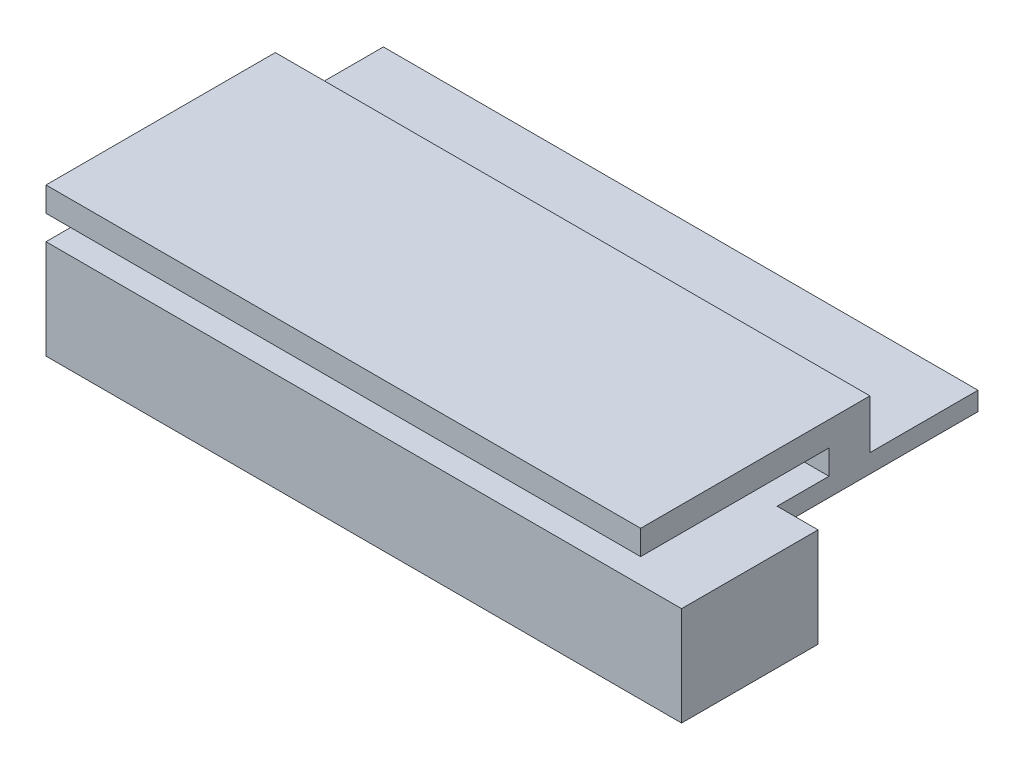
ISO-10303-21;
HEADER;
FILE_DESCRIPTION(('STEP AP214'),'2;1');
FILE_NAME('part.step','',(''),(''),'','','');
FILE_SCHEMA(('AUTOMOTIVE_DESIGN { 1 0 10303 214 1 1 1 1 }'));
ENDSEC;
DATA;
#1=APPLICATION_CONTEXT('core data for automotive mechanical design processes');
#2=APPLICATION_PROTOCOL_DEFINITION('international standard','automotive_design',2000,#1);
#3=PRODUCT_CONTEXT('',#1,'mechanical');
#4=PRODUCT('Part','Part','',(#3));
#5=PRODUCT_RELATED_PRODUCT_CATEGORY('part','',(#4));
#6=PRODUCT_DEFINITION_FORMATION('','',#4);
#7=PRODUCT_DEFINITION_CONTEXT('part definition',#1,'design');
#8=PRODUCT_DEFINITION('design','',#6,#7);
#9=PRODUCT_DEFINITION_SHAPE('','',#8);
#10=(LENGTH_UNIT() NAMED_UNIT(*) SI_UNIT(.MILLI.,.METRE.));
#11=(NAMED_UNIT(*) PLANE_ANGLE_UNIT() SI_UNIT($,.RADIAN.));
#12=(NAMED_UNIT(*) SI_UNIT($,.STERADIAN.) SOLID_ANGLE_UNIT());
#13=UNCERTAINTY_MEASURE_WITH_UNIT(LENGTH_MEASURE(1.E-05),#10,'distance_accuracy_value','');
#14=(GEOMETRIC_REPRESENTATION_CONTEXT(3) GLOBAL_UNCERTAINTY_ASSIGNED_CONTEXT((#13)) GLOBAL_UNIT_ASSIGNED_CONTEXT((#10,
#11,#12)) REPRESENTATION_CONTEXT('',''));
#15=CARTESIAN_POINT('',(0.,0.,0.));
#16=DIRECTION('',(0.,0.,1.));
#17=DIRECTION('',(1.,0.,0.));
#18=AXIS2_PLACEMENT_3D('',#15,#16,#17);
#19=CARTESIAN_POINT('',(0.,0.,0.));
#20=DIRECTION('',(0.,1.,0.));
#21=DIRECTION('',(0.,0.,1.));
#22=AXIS2_PLACEMENT_3D('',#19,#20,#21);
#23=PLANE('',#22);
#24=DIRECTION('',(0.,0.,1.));
#25=VECTOR('',#24,1.);
#26=CARTESIAN_POINT('',(-3.2,0.,0.));
#27=LINE('',#26,#25);
#28=CARTESIAN_POINT('',(-3.2,0.,-0.2));
#29=VERTEX_POINT('',#28);
#30=CARTESIAN_POINT('',(-3.2,0.,7.71695));
#31=VERTEX_POINT('',#30);
#32=EDGE_CURVE('E65',#29,#31,#27,.T.);
#33=ORIENTED_EDGE('',*,*,#32,.T.);
#34=DIRECTION('',(1.,0.,0.));
#35=VECTOR('',#34,1.);
#36=CARTESIAN_POINT('',(0.,0.,7.71695));
#37=LINE('',#36,#35);
#38=CARTESIAN_POINT('',(40.36375,0.,7.71695));
#39=VERTEX_POINT('',#38);
#40=EDGE_CURVE('E208',#31,#39,#37,.T.);
#41=ORIENTED_EDGE('',*,*,#40,.T.);
#42=DIRECTION('',(0.,0.,1.));
#43=VECTOR('',#42,1.);
#44=CARTESIAN_POINT('',(40.36375,0.,0.));
#45=LINE('',#44,#43);
#46=CARTESIAN_POINT('',(40.36375,0.,-0.2));
#47=VERTEX_POINT('',#46);
#48=EDGE_CURVE('E431',#47,#39,#45,.T.);
#49=ORIENTED_EDGE('',*,*,#48,.F.);
#50=DIRECTION('',(1.,0.,0.));
#51=VECTOR('',#50,1.);
#52=CARTESIAN_POINT('',(0.,0.,-0.2));
#53=LINE('',#52,#51);
#54=EDGE_CURVE('E435',#29,#47,#53,.T.);
#55=ORIENTED_EDGE('',*,*,#54,.F.);
#56=EDGE_LOOP('',(#33,#41,#49,#55));
#57=FACE_BOUND('',#56,.T.);
#58=ADVANCED_FACE('F39',(#57),#23,.T.);
#59=CARTESIAN_POINT('',(0.,-1.36,0.));
#60=DIRECTION('',(0.,1.,0.));
#61=DIRECTION('',(0.,0.,1.));
#62=AXIS2_PLACEMENT_3D('',#59,#60,#61);
#63=PLANE('',#62);
#64=DIRECTION('',(0.,0.,1.));
#65=VECTOR('',#64,1.);
#66=CARTESIAN_POINT('',(2.8,-1.36,0.));
#67=LINE('',#66,#65);
#68=CARTESIAN_POINT('',(2.8,-1.36,-0.2));
#69=VERTEX_POINT('',#68);
#70=CARTESIAN_POINT('',(2.8,-1.36,18.51695));
#71=VERTEX_POINT('',#70);
#72=EDGE_CURVE('E397',#69,#71,#67,.T.);
#73=ORIENTED_EDGE('',*,*,#72,.F.);
#74=DIRECTION('',(1.,0.,0.));
#75=VECTOR('',#74,1.);
#76=CARTESIAN_POINT('',(0.,-1.36,-0.2));
#77=LINE('',#76,#75);
#78=CARTESIAN_POINT('',(40.36375,-1.36,-0.2));
#79=VERTEX_POINT('',#78);
#80=EDGE_CURVE('E423',#69,#79,#77,.T.);
#81=ORIENTED_EDGE('',*,*,#80,.T.);
#82=DIRECTION('',(0.,0.,1.));
#83=VECTOR('',#82,1.);
#84=CARTESIAN_POINT('',(40.36375,-1.36,0.));
#85=LINE('',#84,#83);
#86=CARTESIAN_POINT('',(40.36375,-1.36,14.51695));
#87=VERTEX_POINT('',#86);
#88=EDGE_CURVE('E420',#79,#87,#85,.T.);
#89=ORIENTED_EDGE('',*,*,#88,.T.);
#90=DIRECTION('',(1.,0.,0.));
#91=VECTOR('',#90,1.);
#92=CARTESIAN_POINT('',(0.,-1.36,14.51695));
#93=LINE('',#92,#91);
#94=CARTESIAN_POINT('',(37.36375,-1.36,14.51695));
#95=VERTEX_POINT('',#94);
#96=EDGE_CURVE('E393',#95,#87,#93,.T.);
#97=ORIENTED_EDGE('',*,*,#96,.F.);
#98=DIRECTION('',(0.,0.,-1.));
#99=VECTOR('',#98,1.);
#100=CARTESIAN_POINT('',(37.36375,-1.36,0.));
#101=LINE('',#100,#99);
#102=CARTESIAN_POINT('',(37.36375,-1.36,18.51695));
#103=VERTEX_POINT('',#102);
#104=EDGE_CURVE('E362',#103,#95,#101,.T.);
#105=ORIENTED_EDGE('',*,*,#104,.F.);
#106=DIRECTION('',(1.,0.,0.));
#107=VECTOR('',#106,1.);
#108=CARTESIAN_POINT('',(0.,-1.36,18.51695));
#109=LINE('',#108,#107);
#110=EDGE_CURVE('E376',#71,#103,#109,.T.);
#111=ORIENTED_EDGE('',*,*,#110,.F.);
#112=EDGE_LOOP('',(#73,#81,#89,#97,#105,#111));
#113=FACE_BOUND('',#112,.T.);
#114=ADVANCED_FACE('F504',(#113),#63,.F.);
#115=CARTESIAN_POINT('',(0.,-1.36,14.51695));
#116=DIRECTION('',(0.,0.,1.));
#117=DIRECTION('',(1.,0.,0.));
#118=AXIS2_PLACEMENT_3D('',#115,#116,#117);
#119=PLANE('',#118);
#120=DIRECTION('',(1.,0.,0.));
#121=VECTOR('',#120,1.);
#122=CARTESIAN_POINT('',(0.,0.,14.51695));
#123=LINE('',#122,#121);
#124=CARTESIAN_POINT('',(40.36375,0.,14.51695));
#125=VERTEX_POINT('',#124);
#126=CARTESIAN_POINT('',(43.36375,0.,14.51695));
#127=VERTEX_POINT('',#126);
#128=EDGE_CURVE('E419',#125,#127,#123,.T.);
#129=ORIENTED_EDGE('',*,*,#128,.T.);
#130=DIRECTION('',(0.,1.,0.));
#131=VECTOR('',#130,1.);
#132=CARTESIAN_POINT('',(43.36375,-1.36,14.51695));
#133=LINE('',#132,#131);
#134=CARTESIAN_POINT('',(43.36375,-7.26,14.51695));
#135=VERTEX_POINT('',#134);
#136=EDGE_CURVE('E11',#135,#127,#133,.T.);
#137=ORIENTED_EDGE('',*,*,#136,.F.);
#138=DIRECTION('',(-1.,0.,0.));
#139=VECTOR('',#138,1.);
#140=CARTESIAN_POINT('',(0.,-7.26,14.51695));
#141=LINE('',#140,#139);
#142=CARTESIAN_POINT('',(37.36375,-7.26,14.51695));
#143=VERTEX_POINT('',#142);
#144=EDGE_CURVE('E300',#135,#143,#141,.T.);
#145=ORIENTED_EDGE('',*,*,#144,.T.);
#146=DIRECTION('',(0.,1.,0.));
#147=VECTOR('',#146,1.);
#148=CARTESIAN_POINT('',(37.36375,-7.26,14.51695));
#149=LINE('',#148,#147);
#150=CARTESIAN_POINT('',(37.36375,-5.26,14.51695));
#151=VERTEX_POINT('',#150);
#152=EDGE_CURVE('E321',#143,#151,#149,.T.);
#153=ORIENTED_EDGE('',*,*,#152,.T.);
#154=DIRECTION('',(-1.,0.,0.));
#155=VECTOR('',#154,1.);
#156=CARTESIAN_POINT('',(0.,-5.26,14.51695));
#157=LINE('',#156,#155);
#158=CARTESIAN_POINT('',(40.36375,-5.26,14.51695));
#159=VERTEX_POINT('',#158);
#160=EDGE_CURVE('E277',#159,#151,#157,.T.);
#161=ORIENTED_EDGE('',*,*,#160,.F.);
#162=DIRECTION('',(0.,1.,0.));
#163=VECTOR('',#162,1.);
#164=CARTESIAN_POINT('',(40.36375,-5.26,14.51695));
#165=LINE('',#164,#163);
#166=CARTESIAN_POINT('',(40.36375,-3.56,14.51695));
#167=VERTEX_POINT('',#166);
#168=EDGE_CURVE('E348',#159,#167,#165,.T.);
#169=ORIENTED_EDGE('',*,*,#168,.T.);
#170=DIRECTION('',(1.,0.,0.));
#171=VECTOR('',#170,1.);
#172=CARTESIAN_POINT('',(0.,-3.56,14.51695));
#173=LINE('',#172,#171);
#174=CARTESIAN_POINT('',(37.36375,-3.56,14.51695));
#175=VERTEX_POINT('',#174);
#176=EDGE_CURVE('E375',#175,#167,#173,.T.);
#177=ORIENTED_EDGE('',*,*,#176,.F.);
#178=DIRECTION('',(0.,1.,0.));
#179=VECTOR('',#178,1.);
#180=CARTESIAN_POINT('',(37.36375,-3.56,14.51695));
#181=LINE('',#180,#179);
#182=EDGE_CURVE('E415',#175,#95,#181,.T.);
#183=ORIENTED_EDGE('',*,*,#182,.T.);
#184=ORIENTED_EDGE('',*,*,#96,.T.);
#185=DIRECTION('',(0.,1.,0.));
#186=VECTOR('',#185,1.);
#187=CARTESIAN_POINT('',(40.36375,-1.36,14.51695));
#188=LINE('',#187,#186);
#189=EDGE_CURVE('E43',#87,#125,#188,.T.);
#190=ORIENTED_EDGE('',*,*,#189,.T.);
#191=EDGE_LOOP('',(#129,#137,#145,#153,#161,#169,#177,#183,#184,#190));
#192=FACE_BOUND('',#191,.T.);
#193=ADVANCED_FACE('F41',(#192),#119,.F.);
#194=CARTESIAN_POINT('',(43.36375,-1.36,0.));
#195=DIRECTION('',(1.,0.,0.));
#196=DIRECTION('',(0.,0.,-1.));
#197=AXIS2_PLACEMENT_3D('',#194,#195,#196);
#198=PLANE('',#197);
#199=DIRECTION('',(0.,0.,-1.));
#200=VECTOR('',#199,1.);
#201=CARTESIAN_POINT('',(43.36375,0.,0.));
#202=LINE('',#201,#200);
#203=CARTESIAN_POINT('',(43.36375,0.,24.51695));
#204=VERTEX_POINT('',#203);
#205=EDGE_CURVE('E424',#204,#127,#202,.T.);
#206=ORIENTED_EDGE('',*,*,#205,.F.);
#207=DIRECTION('',(0.,1.,0.));
#208=VECTOR('',#207,1.);
#209=CARTESIAN_POINT('',(43.36375,-1.36,24.51695));
#210=LINE('',#209,#208);
#211=CARTESIAN_POINT('',(43.36375,-7.26,24.51695));
#212=VERTEX_POINT('',#211);
#213=EDGE_CURVE('E49',#212,#204,#210,.T.);
#214=ORIENTED_EDGE('',*,*,#213,.F.);
#215=DIRECTION('',(0.,0.,1.));
#216=VECTOR('',#215,1.);
#217=CARTESIAN_POINT('',(43.36375,-7.26,0.));
#218=LINE('',#217,#216);
#219=EDGE_CURVE('E296',#135,#212,#218,.T.);
#220=ORIENTED_EDGE('',*,*,#219,.F.);
#221=ORIENTED_EDGE('',*,*,#136,.T.);
#222=EDGE_LOOP('',(#206,#214,#220,#221));
#223=FACE_BOUND('',#222,.T.);
#224=ADVANCED_FACE('F472',(#223),#198,.T.);
#225=CARTESIAN_POINT('',(0.,-1.36,24.51695));
#226=DIRECTION('',(0.,0.,1.));
#227=DIRECTION('',(1.,0.,0.));
#228=AXIS2_PLACEMENT_3D('',#225,#226,#227);
#229=PLANE('',#228);
#230=DIRECTION('',(1.,0.,0.));
#231=VECTOR('',#230,1.);
#232=CARTESIAN_POINT('',(0.,0.,24.51695));
#233=LINE('',#232,#231);
#234=CARTESIAN_POINT('',(-3.2,0.,24.51695));
#235=VERTEX_POINT('',#234);
#236=EDGE_CURVE('E441',#235,#204,#233,.T.);
#237=ORIENTED_EDGE('',*,*,#236,.F.);
#238=DIRECTION('',(0.,1.,0.));
#239=VECTOR('',#238,1.);
#240=CARTESIAN_POINT('',(-3.2,-1.36,24.51695));
#241=LINE('',#240,#239);
#242=CARTESIAN_POINT('',(-3.19999999999999,-7.26,24.51695));
#243=VERTEX_POINT('',#242);
#244=EDGE_CURVE('E450',#243,#235,#241,.T.);
#245=ORIENTED_EDGE('',*,*,#244,.F.);
#246=DIRECTION('',(-1.,0.,0.));
#247=VECTOR('',#246,1.);
#248=CARTESIAN_POINT('',(0.,-7.26,24.51695));
#249=LINE('',#248,#247);
#250=EDGE_CURVE('E292',#212,#243,#249,.T.);
#251=ORIENTED_EDGE('',*,*,#250,.F.);
#252=ORIENTED_EDGE('',*,*,#213,.T.);
#253=EDGE_LOOP('',(#237,#245,#251,#252));
#254=FACE_BOUND('',#253,.T.);
#255=ADVANCED_FACE('F533',(#254),#229,.T.);
#256=CARTESIAN_POINT('',(-3.2,-1.36,0.));
#257=DIRECTION('',(-1.,0.,0.));
#258=DIRECTION('',(0.,0.,1.));
#259=AXIS2_PLACEMENT_3D('',#256,#257,#258);
#260=PLANE('',#259);
#261=ORIENTED_EDGE('',*,*,#32,.F.);
#262=DIRECTION('',(0.,1.,0.));
#263=VECTOR('',#262,1.);
#264=CARTESIAN_POINT('',(-3.2,-1.36,-0.2));
#265=LINE('',#264,#263);
#266=CARTESIAN_POINT('',(-3.2,-7.26,-0.199999999999998));
#267=VERTEX_POINT('',#266);
#268=EDGE_CURVE('E454',#267,#29,#265,.T.);
#269=ORIENTED_EDGE('',*,*,#268,.F.);
#270=DIRECTION('',(0.,0.,-1.));
#271=VECTOR('',#270,1.);
#272=CARTESIAN_POINT('',(-3.2,-7.26,0.));
#273=LINE('',#272,#271);
#274=EDGE_CURVE('E288',#243,#267,#273,.T.);
#275=ORIENTED_EDGE('',*,*,#274,.F.);
#276=ORIENTED_EDGE('',*,*,#244,.T.);
#277=CARTESIAN_POINT('',(-3.2,0.,10.71695));
#278=VERTEX_POINT('',#277);
#279=EDGE_CURVE('E438',#278,#235,#27,.T.);
#280=ORIENTED_EDGE('',*,*,#279,.F.);
#281=DIRECTION('',(0.,-1.,0.));
#282=VECTOR('',#281,1.);
#283=CARTESIAN_POINT('',(-3.2,1.8,10.71695));
#284=LINE('',#283,#282);
#285=CARTESIAN_POINT('',(-3.2,1.8,10.71695));
#286=VERTEX_POINT('',#285);
#287=EDGE_CURVE('E267',#286,#278,#284,.T.);
#288=ORIENTED_EDGE('',*,*,#287,.F.);
#289=DIRECTION('',(0.,0.,-1.));
#290=VECTOR('',#289,1.);
#291=CARTESIAN_POINT('',(-3.2,1.8,0.));
#292=LINE('',#291,#290);
#293=CARTESIAN_POINT('',(-3.19999999999999,1.8,24.51695));
#294=VERTEX_POINT('',#293);
#295=EDGE_CURVE('E243',#294,#286,#292,.T.);
#296=ORIENTED_EDGE('',*,*,#295,.F.);
#297=DIRECTION('',(0.,-1.,0.));
#298=VECTOR('',#297,1.);
#299=CARTESIAN_POINT('',(-3.19999999999999,3.6,24.51695));
#300=LINE('',#299,#298);
#301=CARTESIAN_POINT('',(-3.19999999999999,3.6,24.51695));
#302=VERTEX_POINT('',#301);
#303=EDGE_CURVE('E228',#302,#294,#300,.T.);
#304=ORIENTED_EDGE('',*,*,#303,.F.);
#305=DIRECTION('',(0.,0.,-1.));
#306=VECTOR('',#305,1.);
#307=CARTESIAN_POINT('',(-3.2,3.6,0.));
#308=LINE('',#307,#306);
#309=CARTESIAN_POINT('',(-3.19999999999999,3.6,7.71695));
#310=VERTEX_POINT('',#309);
#311=EDGE_CURVE('E220',#302,#310,#308,.T.);
#312=ORIENTED_EDGE('',*,*,#311,.T.);
#313=DIRECTION('',(0.,-1.,0.));
#314=VECTOR('',#313,1.);
#315=CARTESIAN_POINT('',(-3.2,1.8,7.71695));
#316=LINE('',#315,#314);
#317=EDGE_CURVE('E203',#310,#31,#316,.T.);
#318=ORIENTED_EDGE('',*,*,#317,.T.);
#319=EDGE_LOOP('',(#261,#269,#275,#276,#280,#288,#296,#304,#312,#318));
#320=FACE_BOUND('',#319,.T.);
#321=ADVANCED_FACE('F226',(#320),#260,.T.);
#322=CARTESIAN_POINT('',(0.,-1.36,-0.2));
#323=DIRECTION('',(0.,0.,1.));
#324=DIRECTION('',(1.,0.,0.));
#325=AXIS2_PLACEMENT_3D('',#322,#323,#324);
#326=PLANE('',#325);
#327=ORIENTED_EDGE('',*,*,#54,.T.);
#328=DIRECTION('',(0.,1.,0.));
#329=VECTOR('',#328,1.);
#330=CARTESIAN_POINT('',(40.36375,-1.36,-0.2));
#331=LINE('',#330,#329);
#332=EDGE_CURVE('E456',#79,#47,#331,.T.);
#333=ORIENTED_EDGE('',*,*,#332,.F.);
#334=ORIENTED_EDGE('',*,*,#80,.F.);
#335=DIRECTION('',(0.,1.,0.));
#336=VECTOR('',#335,1.);
#337=CARTESIAN_POINT('',(2.8,-3.56,-0.2));
#338=LINE('',#337,#336);
#339=CARTESIAN_POINT('',(2.8,-3.56,-0.2));
#340=VERTEX_POINT('',#339);
#341=EDGE_CURVE('E411',#340,#69,#338,.T.);
#342=ORIENTED_EDGE('',*,*,#341,.F.);
#343=DIRECTION('',(1.,0.,0.));
#344=VECTOR('',#343,1.);
#345=CARTESIAN_POINT('',(0.,-3.56,-0.2));
#346=LINE('',#345,#344);
#347=CARTESIAN_POINT('',(-0.2,-3.56,-0.2));
#348=VERTEX_POINT('',#347);
#349=EDGE_CURVE('E380',#348,#340,#346,.T.);
#350=ORIENTED_EDGE('',*,*,#349,.F.);
#351=DIRECTION('',(0.,1.,0.));
#352=VECTOR('',#351,1.);
#353=CARTESIAN_POINT('',(-0.2,-5.26,-0.2));
#354=LINE('',#353,#352);
#355=CARTESIAN_POINT('',(-0.2,-5.26,-0.2));
#356=VERTEX_POINT('',#355);
#357=EDGE_CURVE('E359',#356,#348,#354,.T.);
#358=ORIENTED_EDGE('',*,*,#357,.F.);
#359=DIRECTION('',(1.,0.,0.));
#360=VECTOR('',#359,1.);
#361=CARTESIAN_POINT('',(0.,-5.26,-0.2));
#362=LINE('',#361,#360);
#363=CARTESIAN_POINT('',(2.8,-5.26,-0.2));
#364=VERTEX_POINT('',#363);
#365=EDGE_CURVE('E316',#356,#364,#362,.T.);
#366=ORIENTED_EDGE('',*,*,#365,.T.);
#367=DIRECTION('',(0.,1.,0.));
#368=VECTOR('',#367,1.);
#369=CARTESIAN_POINT('',(2.8,-7.26,-0.2));
#370=LINE('',#369,#368);
#371=CARTESIAN_POINT('',(2.8,-7.26,-0.2));
#372=VERTEX_POINT('',#371);
#373=EDGE_CURVE('E326',#372,#364,#370,.T.);
#374=ORIENTED_EDGE('',*,*,#373,.F.);
#375=DIRECTION('',(1.,0.,0.));
#376=VECTOR('',#375,1.);
#377=CARTESIAN_POINT('',(0.,-7.26,-0.2));
#378=LINE('',#377,#376);
#379=EDGE_CURVE('E285',#267,#372,#378,.T.);
#380=ORIENTED_EDGE('',*,*,#379,.F.);
#381=ORIENTED_EDGE('',*,*,#268,.T.);
#382=EDGE_LOOP('',(#327,#333,#334,#342,#350,#358,#366,#374,#380,#381));
#383=FACE_BOUND('',#382,.T.);
#384=ADVANCED_FACE('F514',(#383),#326,.F.);
#385=CARTESIAN_POINT('',(40.36375,-1.36,0.));
#386=DIRECTION('',(-1.,0.,0.));
#387=DIRECTION('',(0.,0.,1.));
#388=AXIS2_PLACEMENT_3D('',#385,#386,#387);
#389=PLANE('',#388);
#390=ORIENTED_EDGE('',*,*,#48,.T.);
#391=DIRECTION('',(0.,-1.,0.));
#392=VECTOR('',#391,1.);
#393=CARTESIAN_POINT('',(40.36375,1.8,7.71695));
#394=LINE('',#393,#392);
#395=CARTESIAN_POINT('',(40.36375,3.6,7.71695));
#396=VERTEX_POINT('',#395);
#397=EDGE_CURVE('E212',#396,#39,#394,.T.);
#398=ORIENTED_EDGE('',*,*,#397,.F.);
#399=DIRECTION('',(0.,0.,-1.));
#400=VECTOR('',#399,1.);
#401=CARTESIAN_POINT('',(40.36375,3.6,0.));
#402=LINE('',#401,#400);
#403=CARTESIAN_POINT('',(40.36375,3.6,24.51695));
#404=VERTEX_POINT('',#403);
#405=EDGE_CURVE('E223',#404,#396,#402,.T.);
#406=ORIENTED_EDGE('',*,*,#405,.F.);
#407=DIRECTION('',(0.,-1.,0.));
#408=VECTOR('',#407,1.);
#409=CARTESIAN_POINT('',(40.36375,3.6,24.51695));
#410=LINE('',#409,#408);
#411=CARTESIAN_POINT('',(40.36375,1.8,24.51695));
#412=VERTEX_POINT('',#411);
#413=EDGE_CURVE('E242',#404,#412,#410,.T.);
#414=ORIENTED_EDGE('',*,*,#413,.T.);
#415=DIRECTION('',(0.,0.,-1.));
#416=VECTOR('',#415,1.);
#417=CARTESIAN_POINT('',(40.36375,1.8,0.));
#418=LINE('',#417,#416);
#419=CARTESIAN_POINT('',(40.36375,1.8,10.71695));
#420=VERTEX_POINT('',#419);
#421=EDGE_CURVE('E234',#412,#420,#418,.T.);
#422=ORIENTED_EDGE('',*,*,#421,.T.);
#423=DIRECTION('',(0.,-1.,0.));
#424=VECTOR('',#423,1.);
#425=CARTESIAN_POINT('',(40.36375,1.8,10.71695));
#426=LINE('',#425,#424);
#427=CARTESIAN_POINT('',(40.36375,0.,10.71695));
#428=VERTEX_POINT('',#427);
#429=EDGE_CURVE('E263',#420,#428,#426,.T.);
#430=ORIENTED_EDGE('',*,*,#429,.T.);
#431=EDGE_CURVE('E430',#428,#125,#45,.T.);
#432=ORIENTED_EDGE('',*,*,#431,.T.);
#433=ORIENTED_EDGE('',*,*,#189,.F.);
#434=ORIENTED_EDGE('',*,*,#88,.F.);
#435=ORIENTED_EDGE('',*,*,#332,.T.);
#436=EDGE_LOOP('',(#390,#398,#406,#414,#422,#430,#432,#433,#434,#435));
#437=FACE_BOUND('',#436,.T.);
#438=ADVANCED_FACE('F516',(#437),#389,.F.);
#439=DIRECTION('',(1.,0.,0.));
#440=VECTOR('',#439,1.);
#441=CARTESIAN_POINT('',(0.,0.,10.71695));
#442=LINE('',#441,#440);
#443=EDGE_CURVE('E57',#278,#428,#442,.T.);
#444=ORIENTED_EDGE('',*,*,#443,.F.);
#445=ORIENTED_EDGE('',*,*,#279,.T.);
#446=ORIENTED_EDGE('',*,*,#236,.T.);
#447=ORIENTED_EDGE('',*,*,#205,.T.);
#448=ORIENTED_EDGE('',*,*,#128,.F.);
#449=ORIENTED_EDGE('',*,*,#431,.F.);
#450=EDGE_LOOP('',(#444,#445,#446,#447,#448,#449));
#451=FACE_BOUND('',#450,.T.);
#452=ADVANCED_FACE('F468',(#451),#23,.T.);
#453=CARTESIAN_POINT('',(37.36375,-3.56,0.));
#454=DIRECTION('',(1.,0.,0.));
#455=DIRECTION('',(0.,0.,-1.));
#456=AXIS2_PLACEMENT_3D('',#453,#454,#455);
#457=PLANE('',#456);
#458=ORIENTED_EDGE('',*,*,#104,.T.);
#459=ORIENTED_EDGE('',*,*,#182,.F.);
#460=DIRECTION('',(0.,0.,-1.));
#461=VECTOR('',#460,1.);
#462=CARTESIAN_POINT('',(37.36375,-3.56,0.));
#463=LINE('',#462,#461);
#464=CARTESIAN_POINT('',(37.36375,-3.56,18.51695));
#465=VERTEX_POINT('',#464);
#466=EDGE_CURVE('E371',#465,#175,#463,.T.);
#467=ORIENTED_EDGE('',*,*,#466,.F.);
#468=DIRECTION('',(0.,1.,0.));
#469=VECTOR('',#468,1.);
#470=CARTESIAN_POINT('',(37.36375,-3.56,18.51695));
#471=LINE('',#470,#469);
#472=EDGE_CURVE('E389',#465,#103,#471,.T.);
#473=ORIENTED_EDGE('',*,*,#472,.T.);
#474=EDGE_LOOP('',(#458,#459,#467,#473));
#475=FACE_BOUND('',#474,.T.);
#476=ADVANCED_FACE('F502',(#475),#457,.F.);
#477=CARTESIAN_POINT('',(2.8,-3.56,0.));
#478=DIRECTION('',(-1.,0.,0.));
#479=DIRECTION('',(0.,0.,1.));
#480=AXIS2_PLACEMENT_3D('',#477,#478,#479);
#481=PLANE('',#480);
#482=ORIENTED_EDGE('',*,*,#72,.T.);
#483=DIRECTION('',(0.,1.,0.));
#484=VECTOR('',#483,1.);
#485=CARTESIAN_POINT('',(2.8,-3.56,18.51695));
#486=LINE('',#485,#484);
#487=CARTESIAN_POINT('',(2.8,-3.56,18.51695));
#488=VERTEX_POINT('',#487);
#489=EDGE_CURVE('E407',#488,#71,#486,.T.);
#490=ORIENTED_EDGE('',*,*,#489,.F.);
#491=DIRECTION('',(0.,0.,1.));
#492=VECTOR('',#491,1.);
#493=CARTESIAN_POINT('',(2.8,-3.56,0.));
#494=LINE('',#493,#492);
#495=EDGE_CURVE('E383',#340,#488,#494,.T.);
#496=ORIENTED_EDGE('',*,*,#495,.F.);
#497=ORIENTED_EDGE('',*,*,#341,.T.);
#498=EDGE_LOOP('',(#482,#490,#496,#497));
#499=FACE_BOUND('',#498,.T.);
#500=ADVANCED_FACE('F510',(#499),#481,.F.);
#501=CARTESIAN_POINT('',(0.,-3.56,18.51695));
#502=DIRECTION('',(0.,0.,1.));
#503=DIRECTION('',(1.,0.,0.));
#504=AXIS2_PLACEMENT_3D('',#501,#502,#503);
#505=PLANE('',#504);
#506=ORIENTED_EDGE('',*,*,#110,.T.);
#507=ORIENTED_EDGE('',*,*,#472,.F.);
#508=DIRECTION('',(1.,0.,0.));
#509=VECTOR('',#508,1.);
#510=CARTESIAN_POINT('',(0.,-3.56,18.51695));
#511=LINE('',#510,#509);
#512=EDGE_CURVE('E386',#488,#465,#511,.T.);
#513=ORIENTED_EDGE('',*,*,#512,.F.);
#514=ORIENTED_EDGE('',*,*,#489,.T.);
#515=EDGE_LOOP('',(#506,#507,#513,#514));
#516=FACE_BOUND('',#515,.T.);
#517=ADVANCED_FACE('F506',(#516),#505,.F.);
#518=CARTESIAN_POINT('',(0.,-3.56,0.));
#519=DIRECTION('',(0.,-1.,0.));
#520=DIRECTION('',(0.,0.,-1.));
#521=AXIS2_PLACEMENT_3D('',#518,#519,#520);
#522=PLANE('',#521);
#523=DIRECTION('',(0.,0.,-1.));
#524=VECTOR('',#523,1.);
#525=CARTESIAN_POINT('',(40.36375,-3.56,0.));
#526=LINE('',#525,#524);
#527=CARTESIAN_POINT('',(40.36375,-3.56,21.51695));
#528=VERTEX_POINT('',#527);
#529=EDGE_CURVE('E325',#528,#167,#526,.T.);
#530=ORIENTED_EDGE('',*,*,#529,.F.);
#531=DIRECTION('',(-1.,0.,0.));
#532=VECTOR('',#531,1.);
#533=CARTESIAN_POINT('',(0.,-3.56,21.51695));
#534=LINE('',#533,#532);
#535=CARTESIAN_POINT('',(-0.2,-3.56,21.51695));
#536=VERTEX_POINT('',#535);
#537=EDGE_CURVE('E352',#528,#536,#534,.T.);
#538=ORIENTED_EDGE('',*,*,#537,.T.);
#539=DIRECTION('',(0.,0.,-1.));
#540=VECTOR('',#539,1.);
#541=CARTESIAN_POINT('',(-0.2,-3.56,0.));
#542=LINE('',#541,#540);
#543=EDGE_CURVE('E340',#536,#348,#542,.T.);
#544=ORIENTED_EDGE('',*,*,#543,.T.);
#545=ORIENTED_EDGE('',*,*,#349,.T.);
#546=ORIENTED_EDGE('',*,*,#495,.T.);
#547=ORIENTED_EDGE('',*,*,#512,.T.);
#548=ORIENTED_EDGE('',*,*,#466,.T.);
#549=ORIENTED_EDGE('',*,*,#176,.T.);
#550=EDGE_LOOP('',(#530,#538,#544,#545,#546,#547,#548,#549));
#551=FACE_BOUND('',#550,.T.);
#552=ADVANCED_FACE('F496',(#551),#522,.T.);
#553=CARTESIAN_POINT('',(-0.2,-5.26,0.));
#554=DIRECTION('',(1.,0.,0.));
#555=DIRECTION('',(0.,0.,-1.));
#556=AXIS2_PLACEMENT_3D('',#553,#554,#555);
#557=PLANE('',#556);
#558=ORIENTED_EDGE('',*,*,#543,.F.);
#559=DIRECTION('',(0.,1.,0.));
#560=VECTOR('',#559,1.);
#561=CARTESIAN_POINT('',(-0.2,-5.26,21.51695));
#562=LINE('',#561,#560);
#563=CARTESIAN_POINT('',(-0.2,-5.26,21.51695));
#564=VERTEX_POINT('',#563);
#565=EDGE_CURVE('E363',#564,#536,#562,.T.);
#566=ORIENTED_EDGE('',*,*,#565,.F.);
#567=DIRECTION('',(0.,0.,-1.));
#568=VECTOR('',#567,1.);
#569=CARTESIAN_POINT('',(-0.2,-5.26,0.));
#570=LINE('',#569,#568);
#571=EDGE_CURVE('E344',#564,#356,#570,.T.);
#572=ORIENTED_EDGE('',*,*,#571,.T.);
#573=ORIENTED_EDGE('',*,*,#357,.T.);
#574=EDGE_LOOP('',(#558,#566,#572,#573));
#575=FACE_BOUND('',#574,.T.);
#576=ADVANCED_FACE('F558',(#575),#557,.T.);
#577=CARTESIAN_POINT('',(0.,-5.26,21.51695));
#578=DIRECTION('',(0.,0.,-1.));
#579=DIRECTION('',(-1.,0.,0.));
#580=AXIS2_PLACEMENT_3D('',#577,#578,#579);
#581=PLANE('',#580);
#582=ORIENTED_EDGE('',*,*,#537,.F.);
#583=DIRECTION('',(0.,1.,0.));
#584=VECTOR('',#583,1.);
#585=CARTESIAN_POINT('',(40.36375,-5.26,21.51695));
#586=LINE('',#585,#584);
#587=CARTESIAN_POINT('',(40.36375,-5.26,21.51695));
#588=VERTEX_POINT('',#587);
#589=EDGE_CURVE('E366',#588,#528,#586,.T.);
#590=ORIENTED_EDGE('',*,*,#589,.F.);
#591=DIRECTION('',(-1.,0.,0.));
#592=VECTOR('',#591,1.);
#593=CARTESIAN_POINT('',(0.,-5.26,21.51695));
#594=LINE('',#593,#592);
#595=EDGE_CURVE('E339',#588,#564,#594,.T.);
#596=ORIENTED_EDGE('',*,*,#595,.T.);
#597=ORIENTED_EDGE('',*,*,#565,.T.);
#598=EDGE_LOOP('',(#582,#590,#596,#597));
#599=FACE_BOUND('',#598,.T.);
#600=ADVANCED_FACE('F563',(#599),#581,.T.);
#601=CARTESIAN_POINT('',(40.36375,-5.26,0.));
#602=DIRECTION('',(1.,0.,0.));
#603=DIRECTION('',(0.,0.,-1.));
#604=AXIS2_PLACEMENT_3D('',#601,#602,#603);
#605=PLANE('',#604);
#606=ORIENTED_EDGE('',*,*,#529,.T.);
#607=ORIENTED_EDGE('',*,*,#168,.F.);
#608=DIRECTION('',(0.,0.,-1.));
#609=VECTOR('',#608,1.);
#610=CARTESIAN_POINT('',(40.36375,-5.26,0.));
#611=LINE('',#610,#609);
#612=EDGE_CURVE('E335',#588,#159,#611,.T.);
#613=ORIENTED_EDGE('',*,*,#612,.F.);
#614=ORIENTED_EDGE('',*,*,#589,.T.);
#615=EDGE_LOOP('',(#606,#607,#613,#614));
#616=FACE_BOUND('',#615,.T.);
#617=ADVANCED_FACE('F493',(#616),#605,.F.);
#618=CARTESIAN_POINT('',(37.36375,-7.26,0.));
#619=DIRECTION('',(-1.,0.,0.));
#620=DIRECTION('',(0.,0.,1.));
#621=AXIS2_PLACEMENT_3D('',#618,#619,#620);
#622=PLANE('',#621);
#623=DIRECTION('',(0.,0.,1.));
#624=VECTOR('',#623,1.);
#625=CARTESIAN_POINT('',(37.36375,-5.26,0.));
#626=LINE('',#625,#624);
#627=CARTESIAN_POINT('',(37.36375,-5.26,18.51695));
#628=VERTEX_POINT('',#627);
#629=EDGE_CURVE('E271',#151,#628,#626,.T.);
#630=ORIENTED_EDGE('',*,*,#629,.F.);
#631=ORIENTED_EDGE('',*,*,#152,.F.);
#632=DIRECTION('',(0.,0.,1.));
#633=VECTOR('',#632,1.);
#634=CARTESIAN_POINT('',(37.36375,-7.26,0.));
#635=LINE('',#634,#633);
#636=CARTESIAN_POINT('',(37.36375,-7.26,18.51695));
#637=VERTEX_POINT('',#636);
#638=EDGE_CURVE('E272',#143,#637,#635,.T.);
#639=ORIENTED_EDGE('',*,*,#638,.T.);
#640=DIRECTION('',(0.,1.,0.));
#641=VECTOR('',#640,1.);
#642=CARTESIAN_POINT('',(37.36375,-7.26,18.51695));
#643=LINE('',#642,#641);
#644=EDGE_CURVE('E304',#637,#628,#643,.T.);
#645=ORIENTED_EDGE('',*,*,#644,.T.);
#646=EDGE_LOOP('',(#630,#631,#639,#645));
#647=FACE_BOUND('',#646,.T.);
#648=ADVANCED_FACE('F484',(#647),#622,.T.);
#649=CARTESIAN_POINT('',(2.8,-7.26,0.));
#650=DIRECTION('',(1.,0.,0.));
#651=DIRECTION('',(0.,0.,-1.));
#652=AXIS2_PLACEMENT_3D('',#649,#650,#651);
#653=PLANE('',#652);
#654=DIRECTION('',(0.,0.,-1.));
#655=VECTOR('',#654,1.);
#656=CARTESIAN_POINT('',(2.8,-5.26,0.));
#657=LINE('',#656,#655);
#658=CARTESIAN_POINT('',(2.8,-5.26,18.51695));
#659=VERTEX_POINT('',#658);
#660=EDGE_CURVE('E312',#659,#364,#657,.T.);
#661=ORIENTED_EDGE('',*,*,#660,.F.);
#662=DIRECTION('',(0.,1.,0.));
#663=VECTOR('',#662,1.);
#664=CARTESIAN_POINT('',(2.8,-7.26,18.51695));
#665=LINE('',#664,#663);
#666=CARTESIAN_POINT('',(2.8,-7.26,18.51695));
#667=VERTEX_POINT('',#666);
#668=EDGE_CURVE('E330',#667,#659,#665,.T.);
#669=ORIENTED_EDGE('',*,*,#668,.F.);
#670=DIRECTION('',(0.,0.,-1.));
#671=VECTOR('',#670,1.);
#672=CARTESIAN_POINT('',(2.8,-7.26,0.));
#673=LINE('',#672,#671);
#674=EDGE_CURVE('E281',#667,#372,#673,.T.);
#675=ORIENTED_EDGE('',*,*,#674,.T.);
#676=ORIENTED_EDGE('',*,*,#373,.T.);
#677=EDGE_LOOP('',(#661,#669,#675,#676));
#678=FACE_BOUND('',#677,.T.);
#679=ADVANCED_FACE('F591',(#678),#653,.T.);
#680=CARTESIAN_POINT('',(0.,-7.26,18.51695));
#681=DIRECTION('',(0.,0.,-1.));
#682=DIRECTION('',(-1.,0.,0.));
#683=AXIS2_PLACEMENT_3D('',#680,#681,#682);
#684=PLANE('',#683);
#685=DIRECTION('',(-1.,0.,0.));
#686=VECTOR('',#685,1.);
#687=CARTESIAN_POINT('',(0.,-5.26,18.51695));
#688=LINE('',#687,#686);
#689=EDGE_CURVE('E308',#628,#659,#688,.T.);
#690=ORIENTED_EDGE('',*,*,#689,.F.);
#691=ORIENTED_EDGE('',*,*,#644,.F.);
#692=DIRECTION('',(-1.,0.,0.));
#693=VECTOR('',#692,1.);
#694=CARTESIAN_POINT('',(0.,-7.26,18.51695));
#695=LINE('',#694,#693);
#696=EDGE_CURVE('E276',#637,#667,#695,.T.);
#697=ORIENTED_EDGE('',*,*,#696,.T.);
#698=ORIENTED_EDGE('',*,*,#668,.T.);
#699=EDGE_LOOP('',(#690,#691,#697,#698));
#700=FACE_BOUND('',#699,.T.);
#701=ADVANCED_FACE('F600',(#700),#684,.T.);
#702=CARTESIAN_POINT('',(0.,-7.26,0.));
#703=DIRECTION('',(0.,-1.,0.));
#704=DIRECTION('',(0.,0.,-1.));
#705=AXIS2_PLACEMENT_3D('',#702,#703,#704);
#706=PLANE('',#705);
#707=ORIENTED_EDGE('',*,*,#638,.F.);
#708=ORIENTED_EDGE('',*,*,#144,.F.);
#709=ORIENTED_EDGE('',*,*,#219,.T.);
#710=ORIENTED_EDGE('',*,*,#250,.T.);
#711=ORIENTED_EDGE('',*,*,#274,.T.);
#712=ORIENTED_EDGE('',*,*,#379,.T.);
#713=ORIENTED_EDGE('',*,*,#674,.F.);
#714=ORIENTED_EDGE('',*,*,#696,.F.);
#715=EDGE_LOOP('',(#707,#708,#709,#710,#711,#712,#713,#714));
#716=FACE_BOUND('',#715,.T.);
#717=ADVANCED_FACE('F479',(#716),#706,.T.);
#718=CARTESIAN_POINT('',(0.,-5.26,0.));
#719=DIRECTION('',(0.,-1.,0.));
#720=DIRECTION('',(0.,0.,-1.));
#721=AXIS2_PLACEMENT_3D('',#718,#719,#720);
#722=PLANE('',#721);
#723=ORIENTED_EDGE('',*,*,#571,.F.);
#724=ORIENTED_EDGE('',*,*,#595,.F.);
#725=ORIENTED_EDGE('',*,*,#612,.T.);
#726=ORIENTED_EDGE('',*,*,#160,.T.);
#727=ORIENTED_EDGE('',*,*,#629,.T.);
#728=ORIENTED_EDGE('',*,*,#689,.T.);
#729=ORIENTED_EDGE('',*,*,#660,.T.);
#730=ORIENTED_EDGE('',*,*,#365,.F.);
#731=EDGE_LOOP('',(#723,#724,#725,#726,#727,#728,#729,#730));
#732=FACE_BOUND('',#731,.T.);
#733=ADVANCED_FACE('F488',(#732),#722,.F.);
#734=CARTESIAN_POINT('',(0.,1.8,10.71695));
#735=DIRECTION('',(0.,0.,-1.));
#736=DIRECTION('',(-1.,0.,0.));
#737=AXIS2_PLACEMENT_3D('',#734,#735,#736);
#738=PLANE('',#737);
#739=ORIENTED_EDGE('',*,*,#443,.T.);
#740=ORIENTED_EDGE('',*,*,#429,.F.);
#741=DIRECTION('',(1.,0.,0.));
#742=VECTOR('',#741,1.);
#743=CARTESIAN_POINT('',(0.,1.8,10.71695));
#744=LINE('',#743,#742);
#745=EDGE_CURVE('E213',#286,#420,#744,.T.);
#746=ORIENTED_EDGE('',*,*,#745,.F.);
#747=ORIENTED_EDGE('',*,*,#287,.T.);
#748=EDGE_LOOP('',(#739,#740,#746,#747));
#749=FACE_BOUND('',#748,.T.);
#750=ADVANCED_FACE('F629',(#749),#738,.F.);
#751=CARTESIAN_POINT('',(0.,1.8,7.71695));
#752=DIRECTION('',(0.,0.,-1.));
#753=DIRECTION('',(-1.,0.,0.));
#754=AXIS2_PLACEMENT_3D('',#751,#752,#753);
#755=PLANE('',#754);
#756=ORIENTED_EDGE('',*,*,#40,.F.);
#757=ORIENTED_EDGE('',*,*,#317,.F.);
#758=DIRECTION('',(-1.,0.,0.));
#759=VECTOR('',#758,1.);
#760=CARTESIAN_POINT('',(0.,3.6,7.71695));
#761=LINE('',#760,#759);
#762=EDGE_CURVE('E207',#396,#310,#761,.T.);
#763=ORIENTED_EDGE('',*,*,#762,.F.);
#764=ORIENTED_EDGE('',*,*,#397,.T.);
#765=EDGE_LOOP('',(#756,#757,#763,#764));
#766=FACE_BOUND('',#765,.T.);
#767=ADVANCED_FACE('F205',(#766),#755,.T.);
#768=CARTESIAN_POINT('',(0.,1.8,0.));
#769=DIRECTION('',(0.,1.,0.));
#770=DIRECTION('',(0.,0.,1.));
#771=AXIS2_PLACEMENT_3D('',#768,#769,#770);
#772=PLANE('',#771);
#773=ORIENTED_EDGE('',*,*,#295,.T.);
#774=ORIENTED_EDGE('',*,*,#745,.T.);
#775=ORIENTED_EDGE('',*,*,#421,.F.);
#776=DIRECTION('',(-1.,0.,0.));
#777=VECTOR('',#776,1.);
#778=CARTESIAN_POINT('',(0.,1.8,24.51695));
#779=LINE('',#778,#777);
#780=EDGE_CURVE('E230',#412,#294,#779,.T.);
#781=ORIENTED_EDGE('',*,*,#780,.T.);
#782=EDGE_LOOP('',(#773,#774,#775,#781));
#783=FACE_BOUND('',#782,.T.);
#784=ADVANCED_FACE('F741',(#783),#772,.F.);
#785=CARTESIAN_POINT('',(0.,3.6,24.51695));
#786=DIRECTION('',(0.,0.,1.));
#787=DIRECTION('',(1.,0.,0.));
#788=AXIS2_PLACEMENT_3D('',#785,#786,#787);
#789=PLANE('',#788);
#790=ORIENTED_EDGE('',*,*,#780,.F.);
#791=ORIENTED_EDGE('',*,*,#413,.F.);
#792=DIRECTION('',(-1.,0.,0.));
#793=VECTOR('',#792,1.);
#794=CARTESIAN_POINT('',(0.,3.6,24.51695));
#795=LINE('',#794,#793);
#796=EDGE_CURVE('E239',#404,#302,#795,.T.);
#797=ORIENTED_EDGE('',*,*,#796,.T.);
#798=ORIENTED_EDGE('',*,*,#303,.T.);
#799=EDGE_LOOP('',(#790,#791,#797,#798));
#800=FACE_BOUND('',#799,.T.);
#801=ADVANCED_FACE('F752',(#800),#789,.T.);
#802=CARTESIAN_POINT('',(0.,3.6,0.));
#803=DIRECTION('',(0.,1.,0.));
#804=DIRECTION('',(0.,0.,1.));
#805=AXIS2_PLACEMENT_3D('',#802,#803,#804);
#806=PLANE('',#805);
#807=ORIENTED_EDGE('',*,*,#311,.F.);
#808=ORIENTED_EDGE('',*,*,#796,.F.);
#809=ORIENTED_EDGE('',*,*,#405,.T.);
#810=ORIENTED_EDGE('',*,*,#762,.T.);
#811=EDGE_LOOP('',(#807,#808,#809,#810));
#812=FACE_BOUND('',#811,.T.);
#813=ADVANCED_FACE('F218',(#812),#806,.T.);
#814=CLOSED_SHELL('',(#58,#114,#193,#224,#255,#321,#384,#438,#452,#476,#500,#517,#552,#576,#600,
#617,#648,#679,#701,#717,#733,#750,#767,#784,#801,#813));
#815=MANIFOLD_SOLID_BREP('B2',#814);
#816=ADVANCED_BREP_SHAPE_REPRESENTATION('',(#18,#815),#14);
#817=SHAPE_DEFINITION_REPRESENTATION(#9,#816);
ENDSEC;
END-ISO-10303-21;
